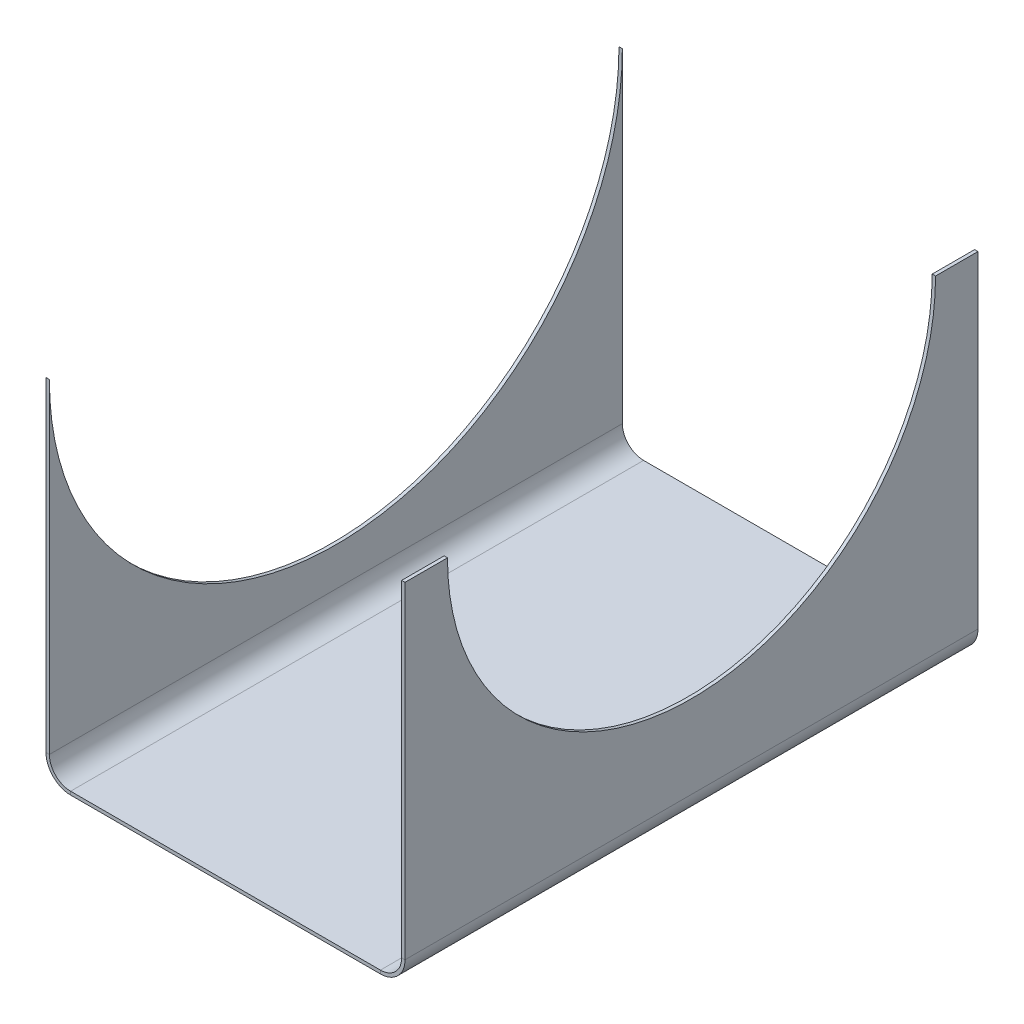
ISO-10303-21;
HEADER;
FILE_DESCRIPTION(('STEP AP214'),'2;1');
FILE_NAME('part.step','',(''),(''),'','','');
FILE_SCHEMA(('AUTOMOTIVE_DESIGN { 1 0 10303 214 1 1 1 1 }'));
ENDSEC;
DATA;
#1=APPLICATION_CONTEXT('core data for automotive mechanical design processes');
#2=APPLICATION_PROTOCOL_DEFINITION('international standard','automotive_design',2000,#1);
#3=PRODUCT_CONTEXT('',#1,'mechanical');
#4=PRODUCT('Part','Part','',(#3));
#5=PRODUCT_RELATED_PRODUCT_CATEGORY('part','',(#4));
#6=PRODUCT_DEFINITION_FORMATION('','',#4);
#7=PRODUCT_DEFINITION_CONTEXT('part definition',#1,'design');
#8=PRODUCT_DEFINITION('design','',#6,#7);
#9=PRODUCT_DEFINITION_SHAPE('','',#8);
#10=(LENGTH_UNIT() NAMED_UNIT(*) SI_UNIT(.MILLI.,.METRE.));
#11=(NAMED_UNIT(*) PLANE_ANGLE_UNIT() SI_UNIT($,.RADIAN.));
#12=(NAMED_UNIT(*) SI_UNIT($,.STERADIAN.) SOLID_ANGLE_UNIT());
#13=UNCERTAINTY_MEASURE_WITH_UNIT(LENGTH_MEASURE(1.E-05),#10,'distance_accuracy_value','');
#14=(GEOMETRIC_REPRESENTATION_CONTEXT(3) GLOBAL_UNCERTAINTY_ASSIGNED_CONTEXT((#13)) GLOBAL_UNIT_ASSIGNED_CONTEXT((#10,
#11,#12)) REPRESENTATION_CONTEXT('',''));
#15=CARTESIAN_POINT('',(0.,0.,0.));
#16=DIRECTION('',(0.,0.,1.));
#17=DIRECTION('',(1.,0.,0.));
#18=AXIS2_PLACEMENT_3D('',#15,#16,#17);
#19=CARTESIAN_POINT('',(0.,1.5875,0.));
#20=DIRECTION('',(0.,1.,0.));
#21=DIRECTION('',(0.,0.,1.));
#22=AXIS2_PLACEMENT_3D('',#19,#20,#21);
#23=PLANE('',#22);
#24=DIRECTION('',(1.,0.,0.));
#25=VECTOR('',#24,1.);
#26=CARTESIAN_POINT('',(0.,1.5875,270.));
#27=LINE('',#26,#25);
#28=CARTESIAN_POINT('',(170.,1.5875,270.));
#29=VERTEX_POINT('',#28);
#30=CARTESIAN_POINT('',(316.,1.5875,270.));
#31=VERTEX_POINT('',#30);
#32=EDGE_CURVE('E49',#29,#31,#27,.T.);
#33=ORIENTED_EDGE('',*,*,#32,.T.);
#34=DIRECTION('',(0.,0.,-1.));
#35=VECTOR('',#34,1.);
#36=CARTESIAN_POINT('',(316.,1.5875,0.));
#37=LINE('',#36,#35);
#38=CARTESIAN_POINT('',(316.,1.58750000000002,0.));
#39=VERTEX_POINT('',#38);
#40=EDGE_CURVE('E272',#31,#39,#37,.T.);
#41=ORIENTED_EDGE('',*,*,#40,.T.);
#42=DIRECTION('',(-1.,0.,0.));
#43=VECTOR('',#42,1.);
#44=CARTESIAN_POINT('',(0.,1.5875,0.));
#45=LINE('',#44,#43);
#46=CARTESIAN_POINT('',(170.,1.5875,0.));
#47=VERTEX_POINT('',#46);
#48=EDGE_CURVE('E264',#39,#47,#45,.T.);
#49=ORIENTED_EDGE('',*,*,#48,.T.);
#50=DIRECTION('',(0.,0.,-1.));
#51=VECTOR('',#50,1.);
#52=CARTESIAN_POINT('',(170.,1.5875,0.));
#53=LINE('',#52,#51);
#54=EDGE_CURVE('E260',#29,#47,#53,.T.);
#55=ORIENTED_EDGE('',*,*,#54,.F.);
#56=EDGE_LOOP('',(#33,#41,#49,#55));
#57=FACE_BOUND('',#56,.T.);
#58=ADVANCED_FACE('F45',(#57),#23,.T.);
#59=CARTESIAN_POINT('',(0.,1.5875,270.));
#60=DIRECTION('',(0.,0.,1.));
#61=DIRECTION('',(1.,0.,0.));
#62=AXIS2_PLACEMENT_3D('',#59,#60,#61);
#63=PLANE('',#62);
#64=DIRECTION('',(1.,0.,0.));
#65=VECTOR('',#64,1.);
#66=CARTESIAN_POINT('',(0.,0.,270.));
#67=LINE('',#66,#65);
#68=CARTESIAN_POINT('',(170.,0.,270.));
#69=VERTEX_POINT('',#68);
#70=CARTESIAN_POINT('',(316.,0.,270.));
#71=VERTEX_POINT('',#70);
#72=EDGE_CURVE('E68',#69,#71,#67,.T.);
#73=ORIENTED_EDGE('',*,*,#72,.T.);
#74=DIRECTION('',(0.,1.,0.));
#75=VECTOR('',#74,1.);
#76=CARTESIAN_POINT('',(316.,1.5875,270.));
#77=LINE('',#76,#75);
#78=EDGE_CURVE('E275',#71,#31,#77,.T.);
#79=ORIENTED_EDGE('',*,*,#78,.T.);
#80=ORIENTED_EDGE('',*,*,#32,.F.);
#81=DIRECTION('',(0.,1.,0.));
#82=VECTOR('',#81,1.);
#83=CARTESIAN_POINT('',(170.,1.5875,270.));
#84=LINE('',#83,#82);
#85=EDGE_CURVE('E269',#69,#29,#84,.T.);
#86=ORIENTED_EDGE('',*,*,#85,.F.);
#87=EDGE_LOOP('',(#73,#79,#80,#86));
#88=FACE_BOUND('',#87,.T.);
#89=ADVANCED_FACE('F288',(#88),#63,.T.);
#90=CARTESIAN_POINT('',(0.,1.5875,0.));
#91=DIRECTION('',(0.,0.,-1.));
#92=DIRECTION('',(-1.,0.,0.));
#93=AXIS2_PLACEMENT_3D('',#90,#91,#92);
#94=PLANE('',#93);
#95=ORIENTED_EDGE('',*,*,#48,.F.);
#96=DIRECTION('',(0.,-1.,0.));
#97=VECTOR('',#96,1.);
#98=CARTESIAN_POINT('',(316.,1.5875,0.));
#99=LINE('',#98,#97);
#100=CARTESIAN_POINT('',(316.,0.,0.));
#101=VERTEX_POINT('',#100);
#102=EDGE_CURVE('E12',#39,#101,#99,.T.);
#103=ORIENTED_EDGE('',*,*,#102,.T.);
#104=DIRECTION('',(1.,0.,0.));
#105=VECTOR('',#104,1.);
#106=CARTESIAN_POINT('',(0.,0.,0.));
#107=LINE('',#106,#105);
#108=CARTESIAN_POINT('',(170.,0.,0.));
#109=VERTEX_POINT('',#108);
#110=EDGE_CURVE('E279',#101,#109,#107,.F.);
#111=ORIENTED_EDGE('',*,*,#110,.T.);
#112=DIRECTION('',(0.,-1.,0.));
#113=VECTOR('',#112,1.);
#114=CARTESIAN_POINT('',(170.,1.5875,0.));
#115=LINE('',#114,#113);
#116=EDGE_CURVE('E263',#47,#109,#115,.T.);
#117=ORIENTED_EDGE('',*,*,#116,.F.);
#118=EDGE_LOOP('',(#95,#103,#111,#117));
#119=FACE_BOUND('',#118,.T.);
#120=ADVANCED_FACE('F47',(#119),#94,.T.);
#121=CARTESIAN_POINT('',(0.,0.,0.));
#122=DIRECTION('',(0.,1.,0.));
#123=DIRECTION('',(0.,0.,1.));
#124=AXIS2_PLACEMENT_3D('',#121,#122,#123);
#125=PLANE('',#124);
#126=DIRECTION('',(0.,0.,-1.));
#127=VECTOR('',#126,1.);
#128=CARTESIAN_POINT('',(316.,0.,0.));
#129=LINE('',#128,#127);
#130=EDGE_CURVE('E54',#71,#101,#129,.T.);
#131=ORIENTED_EDGE('',*,*,#130,.F.);
#132=ORIENTED_EDGE('',*,*,#72,.F.);
#133=DIRECTION('',(0.,0.,-1.));
#134=VECTOR('',#133,1.);
#135=CARTESIAN_POINT('',(170.,0.,0.));
#136=LINE('',#135,#134);
#137=EDGE_CURVE('E267',#69,#109,#136,.T.);
#138=ORIENTED_EDGE('',*,*,#137,.T.);
#139=ORIENTED_EDGE('',*,*,#110,.F.);
#140=EDGE_LOOP('',(#131,#132,#138,#139));
#141=FACE_BOUND('',#140,.T.);
#142=ADVANCED_FACE('F296',(#141),#125,.F.);
#143=CARTESIAN_POINT('',(170.,11.5875,270.));
#144=DIRECTION('',(0.,0.,-1.));
#145=DIRECTION('',(-1.,0.,0.));
#146=AXIS2_PLACEMENT_3D('',#143,#144,#145);
#147=PLANE('',#146);
#148=DIRECTION('',(1.,0.,0.));
#149=VECTOR('',#148,1.);
#150=CARTESIAN_POINT('',(160.,11.5875,270.));
#151=LINE('',#150,#149);
#152=CARTESIAN_POINT('',(158.4125,11.5875000000001,270.));
#153=VERTEX_POINT('',#152);
#154=CARTESIAN_POINT('',(160.,11.5875,270.));
#155=VERTEX_POINT('',#154);
#156=EDGE_CURVE('E219',#153,#155,#151,.T.);
#157=ORIENTED_EDGE('',*,*,#156,.F.);
#158=CARTESIAN_POINT('',(170.,11.5875,270.));
#159=DIRECTION('',(0.,0.,1.));
#160=DIRECTION('',(1.,0.,0.));
#161=AXIS2_PLACEMENT_3D('',#158,#159,#160);
#162=CIRCLE('',#161,11.5875);
#163=EDGE_CURVE('E221',#153,#69,#162,.T.);
#164=ORIENTED_EDGE('',*,*,#163,.T.);
#165=ORIENTED_EDGE('',*,*,#85,.T.);
#166=CARTESIAN_POINT('',(170.,11.5875,270.));
#167=DIRECTION('',(0.,0.,1.));
#168=DIRECTION('',(1.,0.,0.));
#169=AXIS2_PLACEMENT_3D('',#166,#167,#168);
#170=CIRCLE('',#169,10.);
#171=EDGE_CURVE('E249',#155,#29,#170,.T.);
#172=ORIENTED_EDGE('',*,*,#171,.F.);
#173=EDGE_LOOP('',(#157,#164,#165,#172));
#174=FACE_BOUND('',#173,.T.);
#175=ADVANCED_FACE('F322',(#174),#147,.F.);
#176=CARTESIAN_POINT('',(170.,11.5875,0.));
#177=DIRECTION('',(0.,0.,1.));
#178=DIRECTION('',(1.,0.,0.));
#179=AXIS2_PLACEMENT_3D('',#176,#177,#178);
#180=PLANE('',#179);
#181=CARTESIAN_POINT('',(170.,11.5875,0.));
#182=DIRECTION('',(0.,0.,1.));
#183=DIRECTION('',(1.,0.,0.));
#184=AXIS2_PLACEMENT_3D('',#181,#182,#183);
#185=CIRCLE('',#184,11.5875);
#186=CARTESIAN_POINT('',(158.4125,11.5875,0.));
#187=VERTEX_POINT('',#186);
#188=EDGE_CURVE('E253',#109,#187,#185,.F.);
#189=ORIENTED_EDGE('',*,*,#188,.T.);
#190=DIRECTION('',(-1.,0.,0.));
#191=VECTOR('',#190,1.);
#192=CARTESIAN_POINT('',(160.,11.5875,0.));
#193=LINE('',#192,#191);
#194=CARTESIAN_POINT('',(160.,11.5875,0.));
#195=VERTEX_POINT('',#194);
#196=EDGE_CURVE('E232',#195,#187,#193,.T.);
#197=ORIENTED_EDGE('',*,*,#196,.F.);
#198=CARTESIAN_POINT('',(170.,11.5875,0.));
#199=DIRECTION('',(0.,0.,-1.));
#200=DIRECTION('',(-1.,0.,0.));
#201=AXIS2_PLACEMENT_3D('',#198,#199,#200);
#202=CIRCLE('',#201,10.);
#203=EDGE_CURVE('E252',#47,#195,#202,.T.);
#204=ORIENTED_EDGE('',*,*,#203,.F.);
#205=ORIENTED_EDGE('',*,*,#116,.T.);
#206=EDGE_LOOP('',(#189,#197,#204,#205));
#207=FACE_BOUND('',#206,.T.);
#208=ADVANCED_FACE('F307',(#207),#180,.F.);
#209=CARTESIAN_POINT('',(170.,11.5875,-135.536475946997));
#210=DIRECTION('',(0.,0.,1.));
#211=DIRECTION('',(1.,0.,0.));
#212=AXIS2_PLACEMENT_3D('',#209,#210,#211);
#213=CYLINDRICAL_SURFACE('',#212,10.);
#214=ORIENTED_EDGE('',*,*,#54,.T.);
#215=ORIENTED_EDGE('',*,*,#203,.T.);
#216=DIRECTION('',(0.,0.,-1.));
#217=VECTOR('',#216,1.);
#218=CARTESIAN_POINT('',(160.,11.5875,0.));
#219=LINE('',#218,#217);
#220=EDGE_CURVE('E237',#155,#195,#219,.T.);
#221=ORIENTED_EDGE('',*,*,#220,.F.);
#222=ORIENTED_EDGE('',*,*,#171,.T.);
#223=EDGE_LOOP('',(#214,#215,#221,#222));
#224=FACE_BOUND('',#223,.T.);
#225=ADVANCED_FACE('F303',(#224),#213,.F.);
#226=CARTESIAN_POINT('',(170.,11.5875,-135.536475946997));
#227=DIRECTION('',(0.,0.,1.));
#228=DIRECTION('',(1.,0.,0.));
#229=AXIS2_PLACEMENT_3D('',#226,#227,#228);
#230=CYLINDRICAL_SURFACE('',#229,11.5875);
#231=ORIENTED_EDGE('',*,*,#137,.F.);
#232=ORIENTED_EDGE('',*,*,#163,.F.);
#233=DIRECTION('',(0.,0.,-1.));
#234=VECTOR('',#233,1.);
#235=CARTESIAN_POINT('',(158.4125,11.5875,0.));
#236=LINE('',#235,#234);
#237=EDGE_CURVE('E217',#153,#187,#236,.T.);
#238=ORIENTED_EDGE('',*,*,#237,.T.);
#239=ORIENTED_EDGE('',*,*,#188,.F.);
#240=EDGE_LOOP('',(#231,#232,#238,#239));
#241=FACE_BOUND('',#240,.T.);
#242=ADVANCED_FACE('F315',(#241),#230,.T.);
#243=CARTESIAN_POINT('',(160.,164.632717147658,135.));
#244=DIRECTION('',(1.,0.,0.));
#245=DIRECTION('',(0.,0.,1.));
#246=AXIS2_PLACEMENT_3D('',#243,#244,#245);
#247=CYLINDRICAL_SURFACE('',#246,135.);
#248=DIRECTION('',(1.,0.,0.));
#249=VECTOR('',#248,1.);
#250=CARTESIAN_POINT('',(160.,164.632717147658,0.));
#251=LINE('',#250,#249);
#252=CARTESIAN_POINT('',(158.4125,164.632717147658,0.));
#253=VERTEX_POINT('',#252);
#254=CARTESIAN_POINT('',(160.,164.632717147658,0.));
#255=VERTEX_POINT('',#254);
#256=EDGE_CURVE('E227',#253,#255,#251,.T.);
#257=ORIENTED_EDGE('',*,*,#256,.F.);
#258=CARTESIAN_POINT('',(158.4125,164.632717147658,135.));
#259=DIRECTION('',(1.,0.,0.));
#260=DIRECTION('',(0.,0.,1.));
#261=AXIS2_PLACEMENT_3D('',#258,#259,#260);
#262=CIRCLE('',#261,135.);
#263=CARTESIAN_POINT('',(158.412500000001,164.632717147658,270.));
#264=VERTEX_POINT('',#263);
#265=EDGE_CURVE('E224',#264,#253,#262,.T.);
#266=ORIENTED_EDGE('',*,*,#265,.F.);
#267=DIRECTION('',(1.,0.,0.));
#268=VECTOR('',#267,1.);
#269=CARTESIAN_POINT('',(160.000000000001,164.632717147658,270.));
#270=LINE('',#269,#268);
#271=CARTESIAN_POINT('',(160.000000000001,164.632717147658,270.));
#272=VERTEX_POINT('',#271);
#273=EDGE_CURVE('E245',#264,#272,#270,.T.);
#274=ORIENTED_EDGE('',*,*,#273,.T.);
#275=CARTESIAN_POINT('',(160.,164.632717147658,135.));
#276=DIRECTION('',(1.,0.,0.));
#277=DIRECTION('',(0.,0.,1.));
#278=AXIS2_PLACEMENT_3D('',#275,#276,#277);
#279=CIRCLE('',#278,135.);
#280=EDGE_CURVE('E242',#272,#255,#279,.T.);
#281=ORIENTED_EDGE('',*,*,#280,.T.);
#282=EDGE_LOOP('',(#257,#266,#274,#281));
#283=FACE_BOUND('',#282,.T.);
#284=ADVANCED_FACE('F330',(#283),#247,.F.);
#285=CARTESIAN_POINT('',(160.,164.632717147658,0.));
#286=DIRECTION('',(1.,0.,0.));
#287=DIRECTION('',(0.,0.,1.));
#288=AXIS2_PLACEMENT_3D('',#285,#286,#287);
#289=PLANE('',#288);
#290=DIRECTION('',(0.,-1.,0.));
#291=VECTOR('',#290,1.);
#292=CARTESIAN_POINT('',(160.000000000001,164.632717147658,270.));
#293=LINE('',#292,#291);
#294=EDGE_CURVE('E239',#272,#155,#293,.T.);
#295=ORIENTED_EDGE('',*,*,#294,.T.);
#296=ORIENTED_EDGE('',*,*,#220,.T.);
#297=DIRECTION('',(0.,1.,0.));
#298=VECTOR('',#297,1.);
#299=CARTESIAN_POINT('',(160.,164.632717147658,0.));
#300=LINE('',#299,#298);
#301=EDGE_CURVE('E235',#195,#255,#300,.T.);
#302=ORIENTED_EDGE('',*,*,#301,.T.);
#303=ORIENTED_EDGE('',*,*,#280,.F.);
#304=EDGE_LOOP('',(#295,#296,#302,#303));
#305=FACE_BOUND('',#304,.T.);
#306=ADVANCED_FACE('F328',(#305),#289,.T.);
#307=CARTESIAN_POINT('',(160.,164.632717147658,0.));
#308=DIRECTION('',(0.,0.,-1.));
#309=DIRECTION('',(0.,1.,0.));
#310=AXIS2_PLACEMENT_3D('',#307,#308,#309);
#311=PLANE('',#310);
#312=ORIENTED_EDGE('',*,*,#301,.F.);
#313=ORIENTED_EDGE('',*,*,#196,.T.);
#314=DIRECTION('',(0.,-1.,0.));
#315=VECTOR('',#314,1.);
#316=CARTESIAN_POINT('',(158.4125,164.632717147658,0.));
#317=LINE('',#316,#315);
#318=EDGE_CURVE('E230',#187,#253,#317,.F.);
#319=ORIENTED_EDGE('',*,*,#318,.T.);
#320=ORIENTED_EDGE('',*,*,#256,.T.);
#321=EDGE_LOOP('',(#312,#313,#319,#320));
#322=FACE_BOUND('',#321,.T.);
#323=ADVANCED_FACE('F310',(#322),#311,.T.);
#324=CARTESIAN_POINT('',(158.4125,164.632717147658,0.));
#325=DIRECTION('',(1.,0.,0.));
#326=DIRECTION('',(0.,0.,1.));
#327=AXIS2_PLACEMENT_3D('',#324,#325,#326);
#328=PLANE('',#327);
#329=ORIENTED_EDGE('',*,*,#237,.F.);
#330=DIRECTION('',(0.,-1.,0.));
#331=VECTOR('',#330,1.);
#332=CARTESIAN_POINT('',(158.412500000001,164.632717147658,270.));
#333=LINE('',#332,#331);
#334=EDGE_CURVE('E222',#264,#153,#333,.T.);
#335=ORIENTED_EDGE('',*,*,#334,.F.);
#336=ORIENTED_EDGE('',*,*,#265,.T.);
#337=ORIENTED_EDGE('',*,*,#318,.F.);
#338=EDGE_LOOP('',(#329,#335,#336,#337));
#339=FACE_BOUND('',#338,.T.);
#340=ADVANCED_FACE('F319',(#339),#328,.F.);
#341=CARTESIAN_POINT('',(160.000000000001,164.632717147658,270.));
#342=DIRECTION('',(0.,0.,1.));
#343=DIRECTION('',(0.,-1.,0.));
#344=AXIS2_PLACEMENT_3D('',#341,#342,#343);
#345=PLANE('',#344);
#346=ORIENTED_EDGE('',*,*,#334,.T.);
#347=ORIENTED_EDGE('',*,*,#156,.T.);
#348=ORIENTED_EDGE('',*,*,#294,.F.);
#349=ORIENTED_EDGE('',*,*,#273,.F.);
#350=EDGE_LOOP('',(#346,#347,#348,#349));
#351=FACE_BOUND('',#350,.T.);
#352=ADVANCED_FACE('F325',(#351),#345,.T.);
#353=CARTESIAN_POINT('',(316.,11.5875,270.));
#354=DIRECTION('',(0.,0.,-1.));
#355=DIRECTION('',(-1.,0.,0.));
#356=AXIS2_PLACEMENT_3D('',#353,#354,#355);
#357=PLANE('',#356);
#358=ORIENTED_EDGE('',*,*,#78,.F.);
#359=CARTESIAN_POINT('',(316.,11.5875,270.));
#360=DIRECTION('',(0.,0.,-1.));
#361=DIRECTION('',(-1.,0.,0.));
#362=AXIS2_PLACEMENT_3D('',#359,#360,#361);
#363=CIRCLE('',#362,11.5875);
#364=CARTESIAN_POINT('',(327.5875,11.5875,270.));
#365=VERTEX_POINT('',#364);
#366=EDGE_CURVE('E174',#71,#365,#363,.F.);
#367=ORIENTED_EDGE('',*,*,#366,.T.);
#368=DIRECTION('',(-1.,0.,0.));
#369=VECTOR('',#368,1.);
#370=CARTESIAN_POINT('',(326.,11.5875,270.));
#371=LINE('',#370,#369);
#372=CARTESIAN_POINT('',(326.,11.5875,270.));
#373=VERTEX_POINT('',#372);
#374=EDGE_CURVE('E168',#365,#373,#371,.T.);
#375=ORIENTED_EDGE('',*,*,#374,.T.);
#376=CARTESIAN_POINT('',(316.,11.5875,270.));
#377=DIRECTION('',(0.,0.,1.));
#378=DIRECTION('',(1.,0.,0.));
#379=AXIS2_PLACEMENT_3D('',#376,#377,#378);
#380=CIRCLE('',#379,10.);
#381=EDGE_CURVE('E211',#31,#373,#380,.T.);
#382=ORIENTED_EDGE('',*,*,#381,.F.);
#383=EDGE_LOOP('',(#358,#367,#375,#382));
#384=FACE_BOUND('',#383,.T.);
#385=ADVANCED_FACE('F290',(#384),#357,.F.);
#386=CARTESIAN_POINT('',(316.,11.5875,0.));
#387=DIRECTION('',(0.,0.,1.));
#388=DIRECTION('',(1.,0.,0.));
#389=AXIS2_PLACEMENT_3D('',#386,#387,#388);
#390=PLANE('',#389);
#391=DIRECTION('',(1.,0.,0.));
#392=VECTOR('',#391,1.);
#393=CARTESIAN_POINT('',(326.,11.5875,0.));
#394=LINE('',#393,#392);
#395=CARTESIAN_POINT('',(326.,11.5875,0.));
#396=VERTEX_POINT('',#395);
#397=CARTESIAN_POINT('',(327.5875,11.5875,0.));
#398=VERTEX_POINT('',#397);
#399=EDGE_CURVE('E206',#396,#398,#394,.T.);
#400=ORIENTED_EDGE('',*,*,#399,.T.);
#401=CARTESIAN_POINT('',(316.,11.5875,0.));
#402=DIRECTION('',(0.,0.,-1.));
#403=DIRECTION('',(-1.,0.,0.));
#404=AXIS2_PLACEMENT_3D('',#401,#402,#403);
#405=CIRCLE('',#404,11.5875);
#406=EDGE_CURVE('E178',#398,#101,#405,.T.);
#407=ORIENTED_EDGE('',*,*,#406,.T.);
#408=ORIENTED_EDGE('',*,*,#102,.F.);
#409=CARTESIAN_POINT('',(316.,11.5875,0.));
#410=DIRECTION('',(0.,0.,-1.));
#411=DIRECTION('',(-1.,0.,0.));
#412=AXIS2_PLACEMENT_3D('',#409,#410,#411);
#413=CIRCLE('',#412,9.99999999999998);
#414=EDGE_CURVE('E214',#396,#39,#413,.T.);
#415=ORIENTED_EDGE('',*,*,#414,.F.);
#416=EDGE_LOOP('',(#400,#407,#408,#415));
#417=FACE_BOUND('',#416,.T.);
#418=ADVANCED_FACE('F294',(#417),#390,.F.);
#419=CARTESIAN_POINT('',(316.,11.5875,405.536475946997));
#420=DIRECTION('',(0.,0.,-1.));
#421=DIRECTION('',(-1.,0.,0.));
#422=AXIS2_PLACEMENT_3D('',#419,#420,#421);
#423=CYLINDRICAL_SURFACE('',#422,10.);
#424=ORIENTED_EDGE('',*,*,#414,.T.);
#425=ORIENTED_EDGE('',*,*,#40,.F.);
#426=ORIENTED_EDGE('',*,*,#381,.T.);
#427=DIRECTION('',(0.,0.,-1.));
#428=VECTOR('',#427,1.);
#429=CARTESIAN_POINT('',(326.,11.5875,0.));
#430=LINE('',#429,#428);
#431=EDGE_CURVE('E208',#373,#396,#430,.T.);
#432=ORIENTED_EDGE('',*,*,#431,.T.);
#433=EDGE_LOOP('',(#424,#425,#426,#432));
#434=FACE_BOUND('',#433,.T.);
#435=ADVANCED_FACE('F446',(#434),#423,.F.);
#436=CARTESIAN_POINT('',(316.,11.5875,405.536475946997));
#437=DIRECTION('',(0.,0.,-1.));
#438=DIRECTION('',(-1.,0.,0.));
#439=AXIS2_PLACEMENT_3D('',#436,#437,#438);
#440=CYLINDRICAL_SURFACE('',#439,11.5875);
#441=ORIENTED_EDGE('',*,*,#406,.F.);
#442=DIRECTION('',(0.,0.,-1.));
#443=VECTOR('',#442,1.);
#444=CARTESIAN_POINT('',(327.5875,11.5875,0.));
#445=LINE('',#444,#443);
#446=EDGE_CURVE('E172',#365,#398,#445,.T.);
#447=ORIENTED_EDGE('',*,*,#446,.F.);
#448=ORIENTED_EDGE('',*,*,#366,.F.);
#449=ORIENTED_EDGE('',*,*,#130,.T.);
#450=EDGE_LOOP('',(#441,#447,#448,#449));
#451=FACE_BOUND('',#450,.T.);
#452=ADVANCED_FACE('F291',(#451),#440,.T.);
#453=CARTESIAN_POINT('',(326.,165.632717147657,0.));
#454=DIRECTION('',(0.,1.,0.));
#455=DIRECTION('',(0.,0.,-1.));
#456=AXIS2_PLACEMENT_3D('',#453,#454,#455);
#457=PLANE('',#456);
#458=DIRECTION('',(-1.,0.,0.));
#459=VECTOR('',#458,1.);
#460=CARTESIAN_POINT('',(326.,165.632717147657,20.0000000000002));
#461=LINE('',#460,#459);
#462=CARTESIAN_POINT('',(327.5875,165.632717147657,20.0000000000002));
#463=VERTEX_POINT('',#462);
#464=CARTESIAN_POINT('',(326.,165.632717147657,20.0000000000002));
#465=VERTEX_POINT('',#464);
#466=EDGE_CURVE('E160',#463,#465,#461,.T.);
#467=ORIENTED_EDGE('',*,*,#466,.F.);
#468=DIRECTION('',(0.,0.,1.));
#469=VECTOR('',#468,1.);
#470=CARTESIAN_POINT('',(327.5875,165.632717147657,0.));
#471=LINE('',#470,#469);
#472=CARTESIAN_POINT('',(327.5875,165.632717147657,0.));
#473=VERTEX_POINT('',#472);
#474=EDGE_CURVE('E161',#463,#473,#471,.F.);
#475=ORIENTED_EDGE('',*,*,#474,.T.);
#476=DIRECTION('',(-1.,0.,0.));
#477=VECTOR('',#476,1.);
#478=CARTESIAN_POINT('',(326.,165.632717147657,0.));
#479=LINE('',#478,#477);
#480=CARTESIAN_POINT('',(326.,165.632717147657,0.));
#481=VERTEX_POINT('',#480);
#482=EDGE_CURVE('E149',#473,#481,#479,.T.);
#483=ORIENTED_EDGE('',*,*,#482,.T.);
#484=DIRECTION('',(0.,0.,-1.));
#485=VECTOR('',#484,1.);
#486=CARTESIAN_POINT('',(326.,165.632717147657,0.));
#487=LINE('',#486,#485);
#488=EDGE_CURVE('E189',#465,#481,#487,.T.);
#489=ORIENTED_EDGE('',*,*,#488,.F.);
#490=EDGE_LOOP('',(#467,#475,#483,#489));
#491=FACE_BOUND('',#490,.T.);
#492=ADVANCED_FACE('F164',(#491),#457,.T.);
#493=CARTESIAN_POINT('',(326.,165.632717147657,135.));
#494=DIRECTION('',(-1.,0.,0.));
#495=DIRECTION('',(0.,0.,1.));
#496=AXIS2_PLACEMENT_3D('',#493,#494,#495);
#497=CYLINDRICAL_SURFACE('',#496,115.);
#498=DIRECTION('',(-1.,0.,0.));
#499=VECTOR('',#498,1.);
#500=CARTESIAN_POINT('',(326.,165.632717147657,250.));
#501=LINE('',#500,#499);
#502=CARTESIAN_POINT('',(327.5875,165.632717147657,250.));
#503=VERTEX_POINT('',#502);
#504=CARTESIAN_POINT('',(326.,165.632717147657,250.));
#505=VERTEX_POINT('',#504);
#506=EDGE_CURVE('E195',#503,#505,#501,.T.);
#507=ORIENTED_EDGE('',*,*,#506,.F.);
#508=CARTESIAN_POINT('',(327.5875,165.632717147657,135.));
#509=DIRECTION('',(-1.,0.,0.));
#510=DIRECTION('',(0.,0.,1.));
#511=AXIS2_PLACEMENT_3D('',#508,#509,#510);
#512=CIRCLE('',#511,115.);
#513=EDGE_CURVE('E175',#463,#503,#512,.T.);
#514=ORIENTED_EDGE('',*,*,#513,.F.);
#515=ORIENTED_EDGE('',*,*,#466,.T.);
#516=CARTESIAN_POINT('',(326.,165.632717147657,135.));
#517=DIRECTION('',(-1.,0.,0.));
#518=DIRECTION('',(0.,0.,1.));
#519=AXIS2_PLACEMENT_3D('',#516,#517,#518);
#520=CIRCLE('',#519,115.);
#521=EDGE_CURVE('E200',#465,#505,#520,.T.);
#522=ORIENTED_EDGE('',*,*,#521,.T.);
#523=EDGE_LOOP('',(#507,#514,#515,#522));
#524=FACE_BOUND('',#523,.T.);
#525=ADVANCED_FACE('F473',(#524),#497,.F.);
#526=DIRECTION('',(-1.,0.,0.));
#527=VECTOR('',#526,1.);
#528=CARTESIAN_POINT('',(326.,165.632717147657,270.));
#529=LINE('',#528,#527);
#530=CARTESIAN_POINT('',(327.5875,165.632717147657,270.));
#531=VERTEX_POINT('',#530);
#532=CARTESIAN_POINT('',(326.,165.632717147657,270.));
#533=VERTEX_POINT('',#532);
#534=EDGE_CURVE('E183',#531,#533,#529,.T.);
#535=ORIENTED_EDGE('',*,*,#534,.F.);
#536=DIRECTION('',(0.,0.,1.));
#537=VECTOR('',#536,1.);
#538=CARTESIAN_POINT('',(327.5875,165.632717147657,0.));
#539=LINE('',#538,#537);
#540=EDGE_CURVE('E197',#531,#503,#539,.F.);
#541=ORIENTED_EDGE('',*,*,#540,.T.);
#542=ORIENTED_EDGE('',*,*,#506,.T.);
#543=EDGE_CURVE('E190',#533,#505,#487,.T.);
#544=ORIENTED_EDGE('',*,*,#543,.F.);
#545=EDGE_LOOP('',(#535,#541,#542,#544));
#546=FACE_BOUND('',#545,.T.);
#547=ADVANCED_FACE('F475',(#546),#457,.T.);
#548=CARTESIAN_POINT('',(326.000000000001,-321.367282852343,0.));
#549=DIRECTION('',(-1.,0.,0.));
#550=DIRECTION('',(0.,0.,1.));
#551=AXIS2_PLACEMENT_3D('',#548,#549,#550);
#552=PLANE('',#551);
#553=ORIENTED_EDGE('',*,*,#431,.F.);
#554=DIRECTION('',(0.,1.,0.));
#555=VECTOR('',#554,1.);
#556=CARTESIAN_POINT('',(326.000000000001,-321.367282852343,270.));
#557=LINE('',#556,#555);
#558=EDGE_CURVE('E193',#373,#533,#557,.T.);
#559=ORIENTED_EDGE('',*,*,#558,.T.);
#560=ORIENTED_EDGE('',*,*,#543,.T.);
#561=ORIENTED_EDGE('',*,*,#521,.F.);
#562=ORIENTED_EDGE('',*,*,#488,.T.);
#563=DIRECTION('',(0.,-1.,0.));
#564=VECTOR('',#563,1.);
#565=CARTESIAN_POINT('',(326.000000000001,-321.367282852343,0.));
#566=LINE('',#565,#564);
#567=EDGE_CURVE('E156',#481,#396,#566,.T.);
#568=ORIENTED_EDGE('',*,*,#567,.T.);
#569=EDGE_LOOP('',(#553,#559,#560,#561,#562,#568));
#570=FACE_BOUND('',#569,.T.);
#571=ADVANCED_FACE('F492',(#570),#552,.T.);
#572=CARTESIAN_POINT('',(326.000000000001,-321.367282852343,270.));
#573=DIRECTION('',(0.,0.,1.));
#574=DIRECTION('',(0.,1.,0.));
#575=AXIS2_PLACEMENT_3D('',#572,#573,#574);
#576=PLANE('',#575);
#577=ORIENTED_EDGE('',*,*,#374,.F.);
#578=DIRECTION('',(0.,1.,0.));
#579=VECTOR('',#578,1.);
#580=CARTESIAN_POINT('',(327.587500000001,-321.367282852343,270.));
#581=LINE('',#580,#579);
#582=EDGE_CURVE('E186',#365,#531,#581,.T.);
#583=ORIENTED_EDGE('',*,*,#582,.T.);
#584=ORIENTED_EDGE('',*,*,#534,.T.);
#585=ORIENTED_EDGE('',*,*,#558,.F.);
#586=EDGE_LOOP('',(#577,#583,#584,#585));
#587=FACE_BOUND('',#586,.T.);
#588=ADVANCED_FACE('F500',(#587),#576,.T.);
#589=CARTESIAN_POINT('',(327.587500000001,-321.367282852343,0.));
#590=DIRECTION('',(-1.,0.,0.));
#591=DIRECTION('',(0.,0.,1.));
#592=AXIS2_PLACEMENT_3D('',#589,#590,#591);
#593=PLANE('',#592);
#594=ORIENTED_EDGE('',*,*,#582,.F.);
#595=ORIENTED_EDGE('',*,*,#446,.T.);
#596=DIRECTION('',(0.,1.,0.));
#597=VECTOR('',#596,1.);
#598=CARTESIAN_POINT('',(327.587500000001,-321.367282852343,0.));
#599=LINE('',#598,#597);
#600=EDGE_CURVE('E153',#473,#398,#599,.F.);
#601=ORIENTED_EDGE('',*,*,#600,.F.);
#602=ORIENTED_EDGE('',*,*,#474,.F.);
#603=ORIENTED_EDGE('',*,*,#513,.T.);
#604=ORIENTED_EDGE('',*,*,#540,.F.);
#605=EDGE_LOOP('',(#594,#595,#601,#602,#603,#604));
#606=FACE_BOUND('',#605,.T.);
#607=ADVANCED_FACE('F170',(#606),#593,.F.);
#608=CARTESIAN_POINT('',(326.000000000001,-321.367282852343,0.));
#609=DIRECTION('',(0.,0.,-1.));
#610=DIRECTION('',(0.,-1.,0.));
#611=AXIS2_PLACEMENT_3D('',#608,#609,#610);
#612=PLANE('',#611);
#613=ORIENTED_EDGE('',*,*,#399,.F.);
#614=ORIENTED_EDGE('',*,*,#567,.F.);
#615=ORIENTED_EDGE('',*,*,#482,.F.);
#616=ORIENTED_EDGE('',*,*,#600,.T.);
#617=EDGE_LOOP('',(#613,#614,#615,#616));
#618=FACE_BOUND('',#617,.T.);
#619=ADVANCED_FACE('F151',(#618),#612,.T.);
#620=CLOSED_SHELL('',(#58,#89,#120,#142,#175,#208,#225,#242,#284,#306,#323,#340,#352,#385,#418,
#435,#452,#492,#525,#547,#571,#588,#607,#619));
#621=MANIFOLD_SOLID_BREP('B2',#620);
#622=ADVANCED_BREP_SHAPE_REPRESENTATION('',(#18,#621),#14);
#623=SHAPE_DEFINITION_REPRESENTATION(#9,#622);
ENDSEC;
END-ISO-10303-21;
